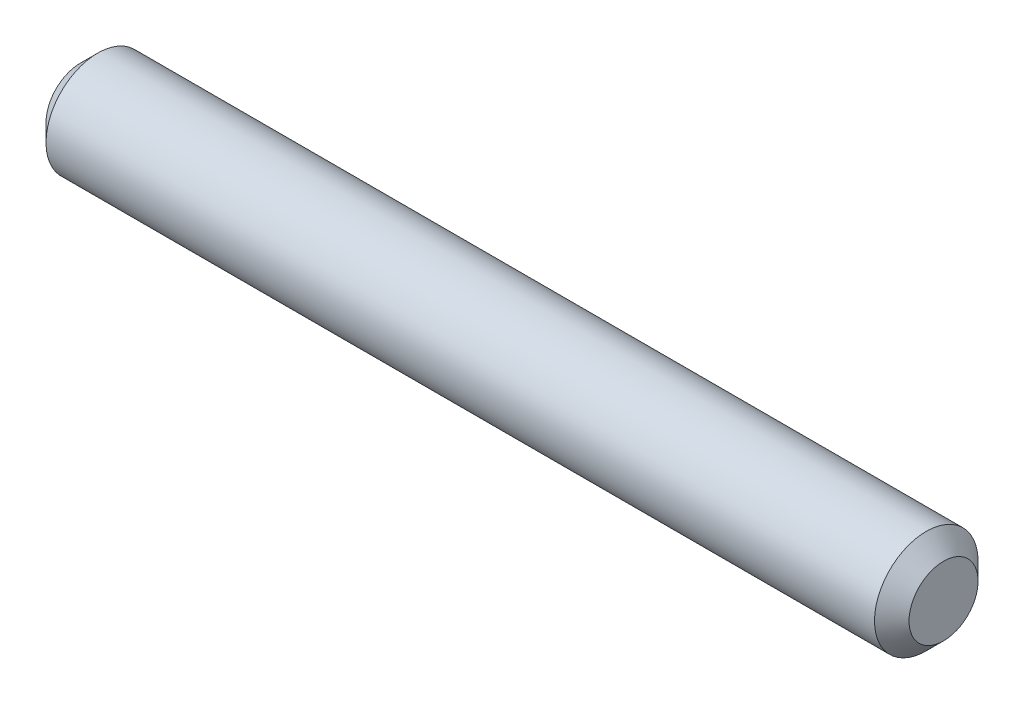
ISO-10303-21;
HEADER;
FILE_DESCRIPTION(('STEP AP214'),'2;1');
FILE_NAME('part.step','',(''),(''),'','','');
FILE_SCHEMA(('AUTOMOTIVE_DESIGN { 1 0 10303 214 1 1 1 1 }'));
ENDSEC;
DATA;
#1=APPLICATION_CONTEXT('core data for automotive mechanical design processes');
#2=APPLICATION_PROTOCOL_DEFINITION('international standard','automotive_design',2000,#1);
#3=PRODUCT_CONTEXT('',#1,'mechanical');
#4=PRODUCT('Part','Part','',(#3));
#5=PRODUCT_RELATED_PRODUCT_CATEGORY('part','',(#4));
#6=PRODUCT_DEFINITION_FORMATION('','',#4);
#7=PRODUCT_DEFINITION_CONTEXT('part definition',#1,'design');
#8=PRODUCT_DEFINITION('design','',#6,#7);
#9=PRODUCT_DEFINITION_SHAPE('','',#8);
#10=(LENGTH_UNIT() NAMED_UNIT(*) SI_UNIT(.MILLI.,.METRE.));
#11=(NAMED_UNIT(*) PLANE_ANGLE_UNIT() SI_UNIT($,.RADIAN.));
#12=(NAMED_UNIT(*) SI_UNIT($,.STERADIAN.) SOLID_ANGLE_UNIT());
#13=UNCERTAINTY_MEASURE_WITH_UNIT(LENGTH_MEASURE(1.E-05),#10,'distance_accuracy_value','');
#14=(GEOMETRIC_REPRESENTATION_CONTEXT(3) GLOBAL_UNCERTAINTY_ASSIGNED_CONTEXT((#13)) GLOBAL_UNIT_ASSIGNED_CONTEXT((#10,
#11,#12)) REPRESENTATION_CONTEXT('',''));
#15=CARTESIAN_POINT('',(0.,0.,0.));
#16=DIRECTION('',(0.,0.,1.));
#17=DIRECTION('',(1.,0.,0.));
#18=AXIS2_PLACEMENT_3D('',#15,#16,#17);
#19=CARTESIAN_POINT('',(4.,0.,0.));
#20=DIRECTION('',(1.,0.,0.));
#21=DIRECTION('',(0.,0.,-1.));
#22=AXIS2_PLACEMENT_3D('',#19,#20,#21);
#23=PLANE('',#22);
#24=CARTESIAN_POINT('',(4.,0.,0.));
#25=DIRECTION('',(-1.,0.,0.));
#26=DIRECTION('',(0.,0.,1.));
#27=AXIS2_PLACEMENT_3D('',#24,#25,#26);
#28=CIRCLE('',#27,1.);
#29=CARTESIAN_POINT('',(4.,0.,1.));
#30=VERTEX_POINT('',#29);
#31=EDGE_CURVE('E10',#30,#30,#28,.T.);
#32=ORIENTED_EDGE('',*,*,#31,.T.);
#33=EDGE_LOOP('',(#32));
#34=FACE_BOUND('',#33,.T.);
#35=ADVANCED_FACE('F31',(#34),#23,.F.);
#36=CARTESIAN_POINT('',(4.5,0.,0.));
#37=DIRECTION('',(1.,0.,0.));
#38=DIRECTION('',(0.,0.,-1.));
#39=AXIS2_PLACEMENT_3D('',#36,#37,#38);
#40=CONICAL_SURFACE('',#39,1.5,0.785398163397447);
#41=ORIENTED_EDGE('',*,*,#31,.F.);
#42=EDGE_LOOP('',(#41));
#43=FACE_BOUND('',#42,.T.);
#44=CARTESIAN_POINT('',(4.5,0.,0.));
#45=DIRECTION('',(-1.,0.,0.));
#46=DIRECTION('',(0.,0.,1.));
#47=AXIS2_PLACEMENT_3D('',#44,#45,#46);
#48=CIRCLE('',#47,1.5);
#49=CARTESIAN_POINT('',(4.5,0.,1.5));
#50=VERTEX_POINT('',#49);
#51=EDGE_CURVE('E37',#50,#50,#48,.T.);
#52=ORIENTED_EDGE('',*,*,#51,.T.);
#53=EDGE_LOOP('',(#52));
#54=FACE_BOUND('',#53,.T.);
#55=ADVANCED_FACE('F63',(#43,#54),#40,.T.);
#56=CARTESIAN_POINT('',(0.,0.,0.));
#57=DIRECTION('',(-1.,0.,0.));
#58=DIRECTION('',(0.,0.,1.));
#59=AXIS2_PLACEMENT_3D('',#56,#57,#58);
#60=CYLINDRICAL_SURFACE('',#59,1.5);
#61=ORIENTED_EDGE('',*,*,#51,.F.);
#62=EDGE_LOOP('',(#61));
#63=FACE_BOUND('',#62,.T.);
#64=CARTESIAN_POINT('',(28.5,0.,0.));
#65=DIRECTION('',(-1.,0.,0.));
#66=DIRECTION('',(0.,0.,1.));
#67=AXIS2_PLACEMENT_3D('',#64,#65,#66);
#68=CIRCLE('',#67,1.5);
#69=CARTESIAN_POINT('',(28.5,0.,1.5));
#70=VERTEX_POINT('',#69);
#71=EDGE_CURVE('E41',#70,#70,#68,.T.);
#72=ORIENTED_EDGE('',*,*,#71,.T.);
#73=EDGE_LOOP('',(#72));
#74=FACE_BOUND('',#73,.T.);
#75=ADVANCED_FACE('F59',(#63,#74),#60,.T.);
#76=CARTESIAN_POINT('',(29.,0.,0.));
#77=DIRECTION('',(-1.,0.,0.));
#78=DIRECTION('',(0.,0.,1.));
#79=AXIS2_PLACEMENT_3D('',#76,#77,#78);
#80=CONICAL_SURFACE('',#79,1.,0.785398163397449);
#81=ORIENTED_EDGE('',*,*,#71,.F.);
#82=EDGE_LOOP('',(#81));
#83=FACE_BOUND('',#82,.T.);
#84=CARTESIAN_POINT('',(29.,0.,0.));
#85=DIRECTION('',(-1.,0.,0.));
#86=DIRECTION('',(0.,0.,1.));
#87=AXIS2_PLACEMENT_3D('',#84,#85,#86);
#88=CIRCLE('',#87,1.);
#89=CARTESIAN_POINT('',(29.,0.,1.));
#90=VERTEX_POINT('',#89);
#91=EDGE_CURVE('E45',#90,#90,#88,.T.);
#92=ORIENTED_EDGE('',*,*,#91,.T.);
#93=EDGE_LOOP('',(#92));
#94=FACE_BOUND('',#93,.T.);
#95=ADVANCED_FACE('F51',(#83,#94),#80,.T.);
#96=CARTESIAN_POINT('',(29.,1.,0.));
#97=DIRECTION('',(-1.,0.,0.));
#98=DIRECTION('',(0.,0.,1.));
#99=AXIS2_PLACEMENT_3D('',#96,#97,#98);
#100=PLANE('',#99);
#101=ORIENTED_EDGE('',*,*,#91,.F.);
#102=EDGE_LOOP('',(#101));
#103=FACE_BOUND('',#102,.T.);
#104=ADVANCED_FACE('F53',(#103),#100,.F.);
#105=CLOSED_SHELL('',(#35,#55,#75,#95,#104));
#106=MANIFOLD_SOLID_BREP('B2',#105);
#107=ADVANCED_BREP_SHAPE_REPRESENTATION('',(#18,#106),#14);
#108=SHAPE_DEFINITION_REPRESENTATION(#9,#107);
ENDSEC;
END-ISO-10303-21;
